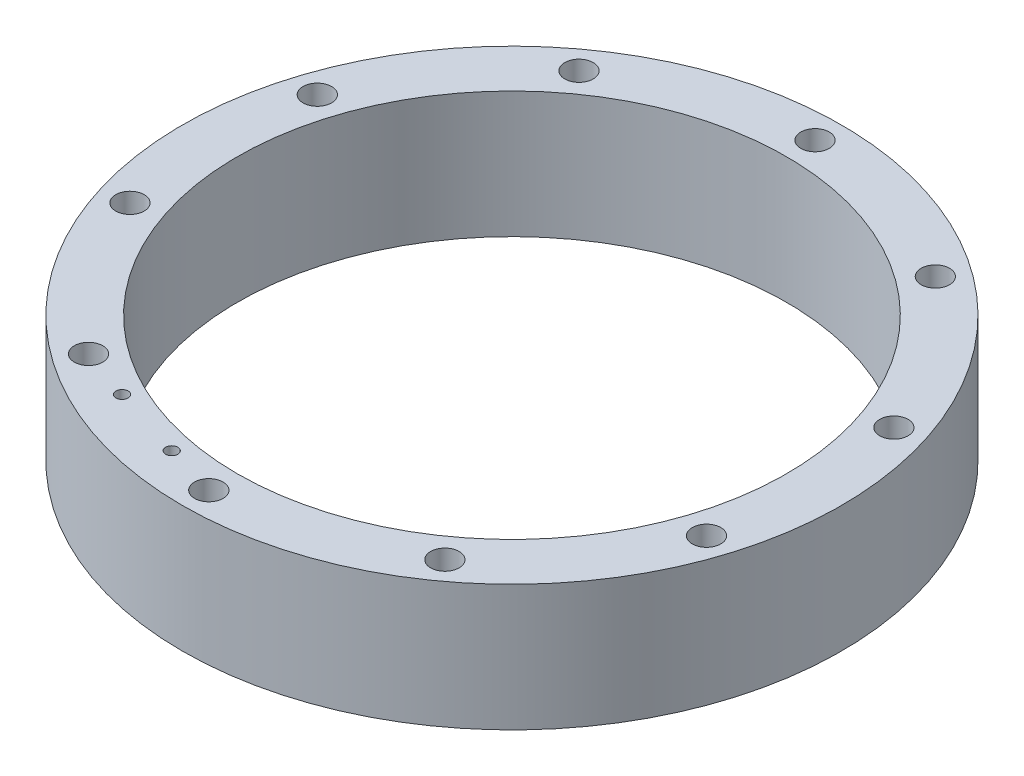
ISO-10303-21;
HEADER;
FILE_DESCRIPTION(('STEP AP214'),'2;1');
FILE_NAME('part.step','',(''),(''),'','','');
FILE_SCHEMA(('AUTOMOTIVE_DESIGN { 1 0 10303 214 1 1 1 1 }'));
ENDSEC;
DATA;
#1=APPLICATION_CONTEXT('core data for automotive mechanical design processes');
#2=APPLICATION_PROTOCOL_DEFINITION('international standard','automotive_design',2000,#1);
#3=PRODUCT_CONTEXT('',#1,'mechanical');
#4=PRODUCT('Part','Part','',(#3));
#5=PRODUCT_RELATED_PRODUCT_CATEGORY('part','',(#4));
#6=PRODUCT_DEFINITION_FORMATION('','',#4);
#7=PRODUCT_DEFINITION_CONTEXT('part definition',#1,'design');
#8=PRODUCT_DEFINITION('design','',#6,#7);
#9=PRODUCT_DEFINITION_SHAPE('','',#8);
#10=(LENGTH_UNIT() NAMED_UNIT(*) SI_UNIT(.MILLI.,.METRE.));
#11=(NAMED_UNIT(*) PLANE_ANGLE_UNIT() SI_UNIT($,.RADIAN.));
#12=(NAMED_UNIT(*) SI_UNIT($,.STERADIAN.) SOLID_ANGLE_UNIT());
#13=UNCERTAINTY_MEASURE_WITH_UNIT(LENGTH_MEASURE(1.E-05),#10,'distance_accuracy_value','');
#14=(GEOMETRIC_REPRESENTATION_CONTEXT(3) GLOBAL_UNCERTAINTY_ASSIGNED_CONTEXT((#13)) GLOBAL_UNIT_ASSIGNED_CONTEXT((#10,
#11,#12)) REPRESENTATION_CONTEXT('',''));
#15=CARTESIAN_POINT('',(0.,0.,0.));
#16=DIRECTION('',(0.,0.,1.));
#17=DIRECTION('',(1.,0.,0.));
#18=AXIS2_PLACEMENT_3D('',#15,#16,#17);
#19=CARTESIAN_POINT('',(0.,15.5,0.));
#20=DIRECTION('',(0.,1.,0.));
#21=DIRECTION('',(0.,0.,1.));
#22=AXIS2_PLACEMENT_3D('',#19,#20,#21);
#23=PLANE('',#22);
#24=CARTESIAN_POINT('',(-6.48348661903638,15.5,35.3254429240283));
#25=DIRECTION('',(0.,1.,0.));
#26=DIRECTION('',(0.,0.,1.));
#27=AXIS2_PLACEMENT_3D('',#24,#25,#26);
#28=CIRCLE('',#27,0.75);
#29=CARTESIAN_POINT('',(-6.48348661903638,15.5,36.0754429240283));
#30=VERTEX_POINT('',#29);
#31=EDGE_CURVE('E124',#30,#30,#28,.T.);
#32=ORIENTED_EDGE('',*,*,#31,.F.);
#33=EDGE_LOOP('',(#32));
#34=FACE_BOUND('',#33,.T.);
#35=CARTESIAN_POINT('',(-15.5185235238403,15.5,32.3897814774663));
#36=DIRECTION('',(0.,1.,0.));
#37=DIRECTION('',(0.,0.,1.));
#38=AXIS2_PLACEMENT_3D('',#35,#36,#37);
#39=CIRCLE('',#38,0.75);
#40=CARTESIAN_POINT('',(-15.5185235238403,15.5,33.1397814774663));
#41=VERTEX_POINT('',#40);
#42=EDGE_CURVE('E121',#41,#41,#39,.T.);
#43=ORIENTED_EDGE('',*,*,#42,.F.);
#44=EDGE_LOOP('',(#43));
#45=FACE_BOUND('',#44,.T.);
#46=CARTESIAN_POINT('',(-21.8950006478949,15.5,-30.1358830404666));
#47=DIRECTION('',(0.,1.,0.));
#48=DIRECTION('',(0.,0.,1.));
#49=AXIS2_PLACEMENT_3D('',#46,#47,#48);
#50=CIRCLE('',#49,1.75);
#51=CARTESIAN_POINT('',(-21.8950006478949,15.5,-28.3858830404666));
#52=VERTEX_POINT('',#51);
#53=EDGE_CURVE('E103',#52,#52,#50,.T.);
#54=ORIENTED_EDGE('',*,*,#53,.F.);
#55=EDGE_LOOP('',(#54));
#56=FACE_BOUND('',#55,.T.);
#57=CARTESIAN_POINT('',(-35.4268552319947,15.5,11.5108830404676));
#58=DIRECTION('',(0.,1.,0.));
#59=DIRECTION('',(0.,0.,1.));
#60=AXIS2_PLACEMENT_3D('',#57,#58,#59);
#61=CIRCLE('',#60,1.75);
#62=CARTESIAN_POINT('',(-35.4268552319947,15.5,13.2608830404676));
#63=VERTEX_POINT('',#62);
#64=EDGE_CURVE('E91',#63,#63,#61,.T.);
#65=ORIENTED_EDGE('',*,*,#64,.F.);
#66=EDGE_LOOP('',(#65));
#67=FACE_BOUND('',#66,.T.);
#68=CARTESIAN_POINT('',(0.,15.5,37.25));
#69=DIRECTION('',(0.,1.,0.));
#70=DIRECTION('',(0.,0.,1.));
#71=AXIS2_PLACEMENT_3D('',#68,#69,#70);
#72=CIRCLE('',#71,1.75);
#73=CARTESIAN_POINT('',(0.,15.5,39.));
#74=VERTEX_POINT('',#73);
#75=EDGE_CURVE('E79',#74,#74,#72,.T.);
#76=ORIENTED_EDGE('',*,*,#75,.F.);
#77=EDGE_LOOP('',(#76));
#78=FACE_BOUND('',#77,.T.);
#79=CARTESIAN_POINT('',(35.4268552319951,15.5,11.5108830404673));
#80=DIRECTION('',(0.,1.,0.));
#81=DIRECTION('',(0.,0.,1.));
#82=AXIS2_PLACEMENT_3D('',#79,#80,#81);
#83=CIRCLE('',#82,1.75);
#84=CARTESIAN_POINT('',(35.4268552319951,15.5,13.2608830404673));
#85=VERTEX_POINT('',#84);
#86=EDGE_CURVE('E67',#85,#85,#83,.T.);
#87=ORIENTED_EDGE('',*,*,#86,.F.);
#88=EDGE_LOOP('',(#87));
#89=FACE_BOUND('',#88,.T.);
#90=CARTESIAN_POINT('',(21.8950006478949,15.5,-30.1358830404668));
#91=DIRECTION('',(0.,1.,0.));
#92=DIRECTION('',(0.,0.,1.));
#93=AXIS2_PLACEMENT_3D('',#90,#91,#92);
#94=CIRCLE('',#93,1.75);
#95=CARTESIAN_POINT('',(21.8950006478949,15.5,-28.3858830404668));
#96=VERTEX_POINT('',#95);
#97=EDGE_CURVE('E55',#96,#96,#94,.T.);
#98=ORIENTED_EDGE('',*,*,#97,.F.);
#99=EDGE_LOOP('',(#98));
#100=FACE_BOUND('',#99,.T.);
#101=CARTESIAN_POINT('',(0.,15.5,0.));
#102=DIRECTION('',(0.,1.,0.));
#103=DIRECTION('',(0.,0.,1.));
#104=AXIS2_PLACEMENT_3D('',#101,#102,#103);
#105=CIRCLE('',#104,40.5);
#106=CARTESIAN_POINT('',(0.,15.5,40.5));
#107=VERTEX_POINT('',#106);
#108=EDGE_CURVE('E10',#107,#107,#105,.T.);
#109=ORIENTED_EDGE('',*,*,#108,.T.);
#110=EDGE_LOOP('',(#109));
#111=FACE_BOUND('',#110,.T.);
#112=CARTESIAN_POINT('',(0.,15.5,-37.25));
#113=DIRECTION('',(0.,1.,0.));
#114=DIRECTION('',(0.,0.,1.));
#115=AXIS2_PLACEMENT_3D('',#112,#113,#114);
#116=CIRCLE('',#115,1.75);
#117=CARTESIAN_POINT('',(0.,15.5,-35.5));
#118=VERTEX_POINT('',#117);
#119=EDGE_CURVE('E50',#118,#118,#116,.T.);
#120=ORIENTED_EDGE('',*,*,#119,.F.);
#121=EDGE_LOOP('',(#120));
#122=FACE_BOUND('',#121,.T.);
#123=CARTESIAN_POINT('',(35.426855231995,15.5,-11.5108830404666));
#124=DIRECTION('',(0.,1.,0.));
#125=DIRECTION('',(0.,0.,1.));
#126=AXIS2_PLACEMENT_3D('',#123,#124,#125);
#127=CIRCLE('',#126,1.75);
#128=CARTESIAN_POINT('',(35.426855231995,15.5,-9.76088304046661));
#129=VERTEX_POINT('',#128);
#130=EDGE_CURVE('E61',#129,#129,#127,.T.);
#131=ORIENTED_EDGE('',*,*,#130,.F.);
#132=EDGE_LOOP('',(#131));
#133=FACE_BOUND('',#132,.T.);
#134=CARTESIAN_POINT('',(21.8950006478946,15.5,30.1358830404668));
#135=DIRECTION('',(0.,1.,0.));
#136=DIRECTION('',(0.,0.,1.));
#137=AXIS2_PLACEMENT_3D('',#134,#135,#136);
#138=CIRCLE('',#137,1.75);
#139=CARTESIAN_POINT('',(21.8950006478946,15.5,31.8858830404668));
#140=VERTEX_POINT('',#139);
#141=EDGE_CURVE('E73',#140,#140,#138,.T.);
#142=ORIENTED_EDGE('',*,*,#141,.F.);
#143=EDGE_LOOP('',(#142));
#144=FACE_BOUND('',#143,.T.);
#145=CARTESIAN_POINT('',(-21.8950006478946,15.5,30.1358830404668));
#146=DIRECTION('',(0.,1.,0.));
#147=DIRECTION('',(0.,0.,1.));
#148=AXIS2_PLACEMENT_3D('',#145,#146,#147);
#149=CIRCLE('',#148,1.75);
#150=CARTESIAN_POINT('',(-21.8950006478946,15.5,31.8858830404668));
#151=VERTEX_POINT('',#150);
#152=EDGE_CURVE('E85',#151,#151,#149,.T.);
#153=ORIENTED_EDGE('',*,*,#152,.F.);
#154=EDGE_LOOP('',(#153));
#155=FACE_BOUND('',#154,.T.);
#156=CARTESIAN_POINT('',(-35.4268552319948,15.5,-11.5108830404663));
#157=DIRECTION('',(0.,1.,0.));
#158=DIRECTION('',(0.,0.,1.));
#159=AXIS2_PLACEMENT_3D('',#156,#157,#158);
#160=CIRCLE('',#159,1.75);
#161=CARTESIAN_POINT('',(-35.4268552319948,15.5,-9.76088304046629));
#162=VERTEX_POINT('',#161);
#163=EDGE_CURVE('E97',#162,#162,#160,.T.);
#164=ORIENTED_EDGE('',*,*,#163,.F.);
#165=EDGE_LOOP('',(#164));
#166=FACE_BOUND('',#165,.T.);
#167=CARTESIAN_POINT('',(0.,15.5,0.));
#168=DIRECTION('',(0.,1.,0.));
#169=DIRECTION('',(0.,0.,1.));
#170=AXIS2_PLACEMENT_3D('',#167,#168,#169);
#171=CIRCLE('',#170,33.75);
#172=CARTESIAN_POINT('',(0.,15.5,33.75));
#173=VERTEX_POINT('',#172);
#174=EDGE_CURVE('E109',#173,#173,#171,.T.);
#175=ORIENTED_EDGE('',*,*,#174,.F.);
#176=EDGE_LOOP('',(#175));
#177=FACE_BOUND('',#176,.T.);
#178=ADVANCED_FACE('F39',(#34,#45,#56,#67,#78,#89,#100,#111,#122,#133,#144,#155,#166,#177),#23,.T.);
#179=CARTESIAN_POINT('',(0.,0.,0.));
#180=DIRECTION('',(0.,1.,0.));
#181=DIRECTION('',(0.,0.,1.));
#182=AXIS2_PLACEMENT_3D('',#179,#180,#181);
#183=PLANE('',#182);
#184=CARTESIAN_POINT('',(-6.48348661903638,0.,35.3254429240283));
#185=DIRECTION('',(0.,1.,0.));
#186=DIRECTION('',(0.,0.,1.));
#187=AXIS2_PLACEMENT_3D('',#184,#185,#186);
#188=CIRCLE('',#187,0.75);
#189=CARTESIAN_POINT('',(-6.48348661903638,0.,36.0754429240283));
#190=VERTEX_POINT('',#189);
#191=EDGE_CURVE('E115',#190,#190,#188,.T.);
#192=ORIENTED_EDGE('',*,*,#191,.T.);
#193=EDGE_LOOP('',(#192));
#194=FACE_BOUND('',#193,.T.);
#195=CARTESIAN_POINT('',(-15.5185235238403,0.,32.3897814774663));
#196=DIRECTION('',(0.,1.,0.));
#197=DIRECTION('',(0.,0.,1.));
#198=AXIS2_PLACEMENT_3D('',#195,#196,#197);
#199=CIRCLE('',#198,0.75);
#200=CARTESIAN_POINT('',(-15.5185235238403,0.,33.1397814774663));
#201=VERTEX_POINT('',#200);
#202=EDGE_CURVE('E118',#201,#201,#199,.T.);
#203=ORIENTED_EDGE('',*,*,#202,.T.);
#204=EDGE_LOOP('',(#203));
#205=FACE_BOUND('',#204,.T.);
#206=CARTESIAN_POINT('',(0.,0.,0.));
#207=DIRECTION('',(0.,1.,0.));
#208=DIRECTION('',(0.,0.,1.));
#209=AXIS2_PLACEMENT_3D('',#206,#207,#208);
#210=CIRCLE('',#209,40.5);
#211=CARTESIAN_POINT('',(0.,0.,40.5));
#212=VERTEX_POINT('',#211);
#213=EDGE_CURVE('E43',#212,#212,#210,.T.);
#214=ORIENTED_EDGE('',*,*,#213,.F.);
#215=EDGE_LOOP('',(#214));
#216=FACE_BOUND('',#215,.T.);
#217=CARTESIAN_POINT('',(0.,0.,-37.25));
#218=DIRECTION('',(0.,1.,0.));
#219=DIRECTION('',(0.,0.,1.));
#220=AXIS2_PLACEMENT_3D('',#217,#218,#219);
#221=CIRCLE('',#220,1.75);
#222=CARTESIAN_POINT('',(0.,0.,-35.5));
#223=VERTEX_POINT('',#222);
#224=EDGE_CURVE('E52',#223,#223,#221,.T.);
#225=ORIENTED_EDGE('',*,*,#224,.T.);
#226=EDGE_LOOP('',(#225));
#227=FACE_BOUND('',#226,.T.);
#228=CARTESIAN_POINT('',(21.8950006478949,0.,-30.1358830404668));
#229=DIRECTION('',(0.,1.,0.));
#230=DIRECTION('',(0.,0.,1.));
#231=AXIS2_PLACEMENT_3D('',#228,#229,#230);
#232=CIRCLE('',#231,1.75);
#233=CARTESIAN_POINT('',(21.8950006478949,0.,-28.3858830404668));
#234=VERTEX_POINT('',#233);
#235=EDGE_CURVE('E58',#234,#234,#232,.T.);
#236=ORIENTED_EDGE('',*,*,#235,.T.);
#237=EDGE_LOOP('',(#236));
#238=FACE_BOUND('',#237,.T.);
#239=CARTESIAN_POINT('',(35.426855231995,0.,-11.5108830404666));
#240=DIRECTION('',(0.,1.,0.));
#241=DIRECTION('',(0.,0.,1.));
#242=AXIS2_PLACEMENT_3D('',#239,#240,#241);
#243=CIRCLE('',#242,1.75);
#244=CARTESIAN_POINT('',(35.426855231995,0.,-9.76088304046661));
#245=VERTEX_POINT('',#244);
#246=EDGE_CURVE('E64',#245,#245,#243,.T.);
#247=ORIENTED_EDGE('',*,*,#246,.T.);
#248=EDGE_LOOP('',(#247));
#249=FACE_BOUND('',#248,.T.);
#250=CARTESIAN_POINT('',(35.4268552319951,0.,11.5108830404673));
#251=DIRECTION('',(0.,1.,0.));
#252=DIRECTION('',(0.,0.,1.));
#253=AXIS2_PLACEMENT_3D('',#250,#251,#252);
#254=CIRCLE('',#253,1.75);
#255=CARTESIAN_POINT('',(35.4268552319951,0.,13.2608830404673));
#256=VERTEX_POINT('',#255);
#257=EDGE_CURVE('E70',#256,#256,#254,.T.);
#258=ORIENTED_EDGE('',*,*,#257,.T.);
#259=EDGE_LOOP('',(#258));
#260=FACE_BOUND('',#259,.T.);
#261=CARTESIAN_POINT('',(21.8950006478946,0.,30.1358830404668));
#262=DIRECTION('',(0.,1.,0.));
#263=DIRECTION('',(0.,0.,1.));
#264=AXIS2_PLACEMENT_3D('',#261,#262,#263);
#265=CIRCLE('',#264,1.75);
#266=CARTESIAN_POINT('',(21.8950006478946,0.,31.8858830404668));
#267=VERTEX_POINT('',#266);
#268=EDGE_CURVE('E76',#267,#267,#265,.T.);
#269=ORIENTED_EDGE('',*,*,#268,.T.);
#270=EDGE_LOOP('',(#269));
#271=FACE_BOUND('',#270,.T.);
#272=CARTESIAN_POINT('',(0.,0.,37.25));
#273=DIRECTION('',(0.,1.,0.));
#274=DIRECTION('',(0.,0.,1.));
#275=AXIS2_PLACEMENT_3D('',#272,#273,#274);
#276=CIRCLE('',#275,1.75);
#277=CARTESIAN_POINT('',(0.,0.,39.));
#278=VERTEX_POINT('',#277);
#279=EDGE_CURVE('E82',#278,#278,#276,.T.);
#280=ORIENTED_EDGE('',*,*,#279,.T.);
#281=EDGE_LOOP('',(#280));
#282=FACE_BOUND('',#281,.T.);
#283=CARTESIAN_POINT('',(-21.8950006478946,0.,30.1358830404668));
#284=DIRECTION('',(0.,1.,0.));
#285=DIRECTION('',(0.,0.,1.));
#286=AXIS2_PLACEMENT_3D('',#283,#284,#285);
#287=CIRCLE('',#286,1.75);
#288=CARTESIAN_POINT('',(-21.8950006478946,0.,31.8858830404668));
#289=VERTEX_POINT('',#288);
#290=EDGE_CURVE('E88',#289,#289,#287,.T.);
#291=ORIENTED_EDGE('',*,*,#290,.T.);
#292=EDGE_LOOP('',(#291));
#293=FACE_BOUND('',#292,.T.);
#294=CARTESIAN_POINT('',(-35.4268552319947,0.,11.5108830404676));
#295=DIRECTION('',(0.,1.,0.));
#296=DIRECTION('',(0.,0.,1.));
#297=AXIS2_PLACEMENT_3D('',#294,#295,#296);
#298=CIRCLE('',#297,1.75);
#299=CARTESIAN_POINT('',(-35.4268552319947,0.,13.2608830404676));
#300=VERTEX_POINT('',#299);
#301=EDGE_CURVE('E94',#300,#300,#298,.T.);
#302=ORIENTED_EDGE('',*,*,#301,.T.);
#303=EDGE_LOOP('',(#302));
#304=FACE_BOUND('',#303,.T.);
#305=CARTESIAN_POINT('',(-35.4268552319948,0.,-11.5108830404663));
#306=DIRECTION('',(0.,1.,0.));
#307=DIRECTION('',(0.,0.,1.));
#308=AXIS2_PLACEMENT_3D('',#305,#306,#307);
#309=CIRCLE('',#308,1.75);
#310=CARTESIAN_POINT('',(-35.4268552319948,0.,-9.76088304046629));
#311=VERTEX_POINT('',#310);
#312=EDGE_CURVE('E100',#311,#311,#309,.T.);
#313=ORIENTED_EDGE('',*,*,#312,.T.);
#314=EDGE_LOOP('',(#313));
#315=FACE_BOUND('',#314,.T.);
#316=CARTESIAN_POINT('',(-21.8950006478949,0.,-30.1358830404666));
#317=DIRECTION('',(0.,1.,0.));
#318=DIRECTION('',(0.,0.,1.));
#319=AXIS2_PLACEMENT_3D('',#316,#317,#318);
#320=CIRCLE('',#319,1.75);
#321=CARTESIAN_POINT('',(-21.8950006478949,0.,-28.3858830404666));
#322=VERTEX_POINT('',#321);
#323=EDGE_CURVE('E106',#322,#322,#320,.T.);
#324=ORIENTED_EDGE('',*,*,#323,.T.);
#325=EDGE_LOOP('',(#324));
#326=FACE_BOUND('',#325,.T.);
#327=CARTESIAN_POINT('',(0.,0.,0.));
#328=DIRECTION('',(0.,1.,0.));
#329=DIRECTION('',(0.,0.,1.));
#330=AXIS2_PLACEMENT_3D('',#327,#328,#329);
#331=CIRCLE('',#330,33.75);
#332=CARTESIAN_POINT('',(0.,0.,33.75));
#333=VERTEX_POINT('',#332);
#334=EDGE_CURVE('E112',#333,#333,#331,.T.);
#335=ORIENTED_EDGE('',*,*,#334,.T.);
#336=EDGE_LOOP('',(#335));
#337=FACE_BOUND('',#336,.T.);
#338=ADVANCED_FACE('F130',(#194,#205,#216,#227,#238,#249,#260,#271,#282,#293,#304,#315,#326,
#337),#183,.F.);
#339=CARTESIAN_POINT('',(0.,15.5,0.));
#340=DIRECTION('',(0.,-1.,0.));
#341=DIRECTION('',(0.,0.,-1.));
#342=AXIS2_PLACEMENT_3D('',#339,#340,#341);
#343=CYLINDRICAL_SURFACE('',#342,40.5);
#344=ORIENTED_EDGE('',*,*,#108,.F.);
#345=EDGE_LOOP('',(#344));
#346=FACE_BOUND('',#345,.T.);
#347=ORIENTED_EDGE('',*,*,#213,.T.);
#348=EDGE_LOOP('',(#347));
#349=FACE_BOUND('',#348,.T.);
#350=ADVANCED_FACE('F41',(#346,#349),#343,.T.);
#351=CARTESIAN_POINT('',(0.,15.5,-37.25));
#352=DIRECTION('',(0.,-1.,0.));
#353=DIRECTION('',(0.,0.,-1.));
#354=AXIS2_PLACEMENT_3D('',#351,#352,#353);
#355=CYLINDRICAL_SURFACE('',#354,1.75);
#356=ORIENTED_EDGE('',*,*,#119,.T.);
#357=EDGE_LOOP('',(#356));
#358=FACE_BOUND('',#357,.T.);
#359=ORIENTED_EDGE('',*,*,#224,.F.);
#360=EDGE_LOOP('',(#359));
#361=FACE_BOUND('',#360,.T.);
#362=ADVANCED_FACE('F179',(#358,#361),#355,.F.);
#363=CARTESIAN_POINT('',(21.8950006478949,15.5,-30.1358830404668));
#364=DIRECTION('',(0.,-1.,0.));
#365=DIRECTION('',(0.,0.,-1.));
#366=AXIS2_PLACEMENT_3D('',#363,#364,#365);
#367=CYLINDRICAL_SURFACE('',#366,1.75);
#368=ORIENTED_EDGE('',*,*,#97,.T.);
#369=EDGE_LOOP('',(#368));
#370=FACE_BOUND('',#369,.T.);
#371=ORIENTED_EDGE('',*,*,#235,.F.);
#372=EDGE_LOOP('',(#371));
#373=FACE_BOUND('',#372,.T.);
#374=ADVANCED_FACE('F184',(#370,#373),#367,.F.);
#375=CARTESIAN_POINT('',(35.426855231995,15.5,-11.5108830404666));
#376=DIRECTION('',(0.,-1.,0.));
#377=DIRECTION('',(0.,0.,-1.));
#378=AXIS2_PLACEMENT_3D('',#375,#376,#377);
#379=CYLINDRICAL_SURFACE('',#378,1.75);
#380=ORIENTED_EDGE('',*,*,#130,.T.);
#381=EDGE_LOOP('',(#380));
#382=FACE_BOUND('',#381,.T.);
#383=ORIENTED_EDGE('',*,*,#246,.F.);
#384=EDGE_LOOP('',(#383));
#385=FACE_BOUND('',#384,.T.);
#386=ADVANCED_FACE('F188',(#382,#385),#379,.F.);
#387=CARTESIAN_POINT('',(35.4268552319951,15.5,11.5108830404673));
#388=DIRECTION('',(0.,-1.,0.));
#389=DIRECTION('',(0.,0.,-1.));
#390=AXIS2_PLACEMENT_3D('',#387,#388,#389);
#391=CYLINDRICAL_SURFACE('',#390,1.75);
#392=ORIENTED_EDGE('',*,*,#86,.T.);
#393=EDGE_LOOP('',(#392));
#394=FACE_BOUND('',#393,.T.);
#395=ORIENTED_EDGE('',*,*,#257,.F.);
#396=EDGE_LOOP('',(#395));
#397=FACE_BOUND('',#396,.T.);
#398=ADVANCED_FACE('F192',(#394,#397),#391,.F.);
#399=CARTESIAN_POINT('',(21.8950006478946,15.5,30.1358830404668));
#400=DIRECTION('',(0.,-1.,0.));
#401=DIRECTION('',(0.,0.,-1.));
#402=AXIS2_PLACEMENT_3D('',#399,#400,#401);
#403=CYLINDRICAL_SURFACE('',#402,1.75);
#404=ORIENTED_EDGE('',*,*,#141,.T.);
#405=EDGE_LOOP('',(#404));
#406=FACE_BOUND('',#405,.T.);
#407=ORIENTED_EDGE('',*,*,#268,.F.);
#408=EDGE_LOOP('',(#407));
#409=FACE_BOUND('',#408,.T.);
#410=ADVANCED_FACE('F196',(#406,#409),#403,.F.);
#411=CARTESIAN_POINT('',(0.,15.5,37.25));
#412=DIRECTION('',(0.,-1.,0.));
#413=DIRECTION('',(0.,0.,-1.));
#414=AXIS2_PLACEMENT_3D('',#411,#412,#413);
#415=CYLINDRICAL_SURFACE('',#414,1.75);
#416=ORIENTED_EDGE('',*,*,#75,.T.);
#417=EDGE_LOOP('',(#416));
#418=FACE_BOUND('',#417,.T.);
#419=ORIENTED_EDGE('',*,*,#279,.F.);
#420=EDGE_LOOP('',(#419));
#421=FACE_BOUND('',#420,.T.);
#422=ADVANCED_FACE('F200',(#418,#421),#415,.F.);
#423=CARTESIAN_POINT('',(-21.8950006478946,15.5,30.1358830404668));
#424=DIRECTION('',(0.,-1.,0.));
#425=DIRECTION('',(0.,0.,-1.));
#426=AXIS2_PLACEMENT_3D('',#423,#424,#425);
#427=CYLINDRICAL_SURFACE('',#426,1.75);
#428=ORIENTED_EDGE('',*,*,#152,.T.);
#429=EDGE_LOOP('',(#428));
#430=FACE_BOUND('',#429,.T.);
#431=ORIENTED_EDGE('',*,*,#290,.F.);
#432=EDGE_LOOP('',(#431));
#433=FACE_BOUND('',#432,.T.);
#434=ADVANCED_FACE('F204',(#430,#433),#427,.F.);
#435=CARTESIAN_POINT('',(-35.4268552319947,15.5,11.5108830404676));
#436=DIRECTION('',(0.,-1.,0.));
#437=DIRECTION('',(0.,0.,-1.));
#438=AXIS2_PLACEMENT_3D('',#435,#436,#437);
#439=CYLINDRICAL_SURFACE('',#438,1.75);
#440=ORIENTED_EDGE('',*,*,#64,.T.);
#441=EDGE_LOOP('',(#440));
#442=FACE_BOUND('',#441,.T.);
#443=ORIENTED_EDGE('',*,*,#301,.F.);
#444=EDGE_LOOP('',(#443));
#445=FACE_BOUND('',#444,.T.);
#446=ADVANCED_FACE('F208',(#442,#445),#439,.F.);
#447=CARTESIAN_POINT('',(-35.4268552319948,15.5,-11.5108830404663));
#448=DIRECTION('',(0.,-1.,0.));
#449=DIRECTION('',(0.,0.,-1.));
#450=AXIS2_PLACEMENT_3D('',#447,#448,#449);
#451=CYLINDRICAL_SURFACE('',#450,1.75);
#452=ORIENTED_EDGE('',*,*,#163,.T.);
#453=EDGE_LOOP('',(#452));
#454=FACE_BOUND('',#453,.T.);
#455=ORIENTED_EDGE('',*,*,#312,.F.);
#456=EDGE_LOOP('',(#455));
#457=FACE_BOUND('',#456,.T.);
#458=ADVANCED_FACE('F212',(#454,#457),#451,.F.);
#459=CARTESIAN_POINT('',(-21.8950006478949,15.5,-30.1358830404666));
#460=DIRECTION('',(0.,-1.,0.));
#461=DIRECTION('',(0.,0.,-1.));
#462=AXIS2_PLACEMENT_3D('',#459,#460,#461);
#463=CYLINDRICAL_SURFACE('',#462,1.75);
#464=ORIENTED_EDGE('',*,*,#53,.T.);
#465=EDGE_LOOP('',(#464));
#466=FACE_BOUND('',#465,.T.);
#467=ORIENTED_EDGE('',*,*,#323,.F.);
#468=EDGE_LOOP('',(#467));
#469=FACE_BOUND('',#468,.T.);
#470=ADVANCED_FACE('F170',(#466,#469),#463,.F.);
#471=CARTESIAN_POINT('',(0.,15.5,0.));
#472=DIRECTION('',(0.,-1.,0.));
#473=DIRECTION('',(0.,0.,-1.));
#474=AXIS2_PLACEMENT_3D('',#471,#472,#473);
#475=CYLINDRICAL_SURFACE('',#474,33.75);
#476=ORIENTED_EDGE('',*,*,#174,.T.);
#477=EDGE_LOOP('',(#476));
#478=FACE_BOUND('',#477,.T.);
#479=ORIENTED_EDGE('',*,*,#334,.F.);
#480=EDGE_LOOP('',(#479));
#481=FACE_BOUND('',#480,.T.);
#482=ADVANCED_FACE('F167',(#478,#481),#475,.F.);
#483=CARTESIAN_POINT('',(-15.5185235238403,0.,32.3897814774663));
#484=DIRECTION('',(0.,1.,0.));
#485=DIRECTION('',(0.,0.,1.));
#486=AXIS2_PLACEMENT_3D('',#483,#484,#485);
#487=CYLINDRICAL_SURFACE('',#486,0.75);
#488=ORIENTED_EDGE('',*,*,#202,.F.);
#489=EDGE_LOOP('',(#488));
#490=FACE_BOUND('',#489,.T.);
#491=ORIENTED_EDGE('',*,*,#42,.T.);
#492=EDGE_LOOP('',(#491));
#493=FACE_BOUND('',#492,.T.);
#494=ADVANCED_FACE('F136',(#490,#493),#487,.F.);
#495=CARTESIAN_POINT('',(-6.48348661903638,0.,35.3254429240283));
#496=DIRECTION('',(0.,1.,0.));
#497=DIRECTION('',(0.,0.,1.));
#498=AXIS2_PLACEMENT_3D('',#495,#496,#497);
#499=CYLINDRICAL_SURFACE('',#498,0.75);
#500=ORIENTED_EDGE('',*,*,#191,.F.);
#501=EDGE_LOOP('',(#500));
#502=FACE_BOUND('',#501,.T.);
#503=ORIENTED_EDGE('',*,*,#31,.T.);
#504=EDGE_LOOP('',(#503));
#505=FACE_BOUND('',#504,.T.);
#506=ADVANCED_FACE('F133',(#502,#505),#499,.F.);
#507=CLOSED_SHELL('',(#178,#338,#350,#362,#374,#386,#398,#410,#422,#434,#446,#458,#470,#482,
#494,#506));
#508=MANIFOLD_SOLID_BREP('B2',#507);
#509=ADVANCED_BREP_SHAPE_REPRESENTATION('',(#18,#508),#14);
#510=SHAPE_DEFINITION_REPRESENTATION(#9,#509);
ENDSEC;
END-ISO-10303-21;
